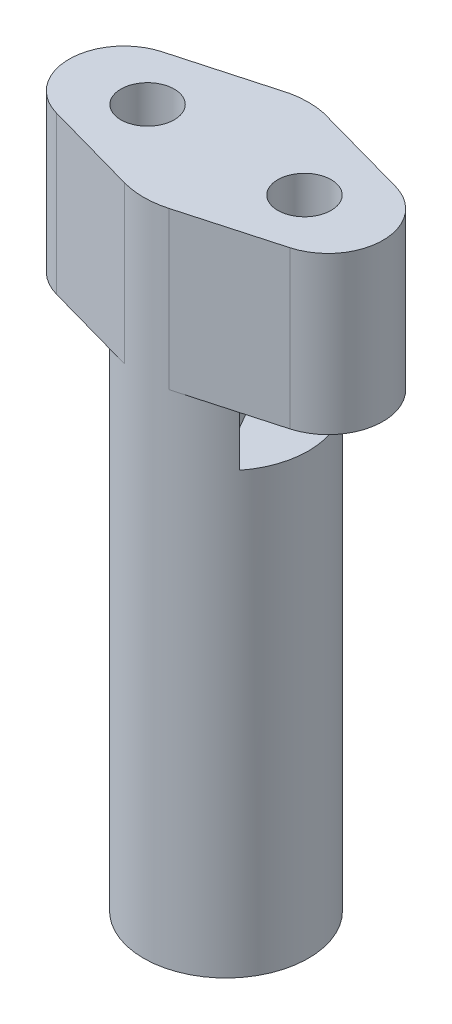
ISO-10303-21;
HEADER;
FILE_DESCRIPTION(('STEP AP214'),'2;1');
FILE_NAME('part.step','',(''),(''),'','','');
FILE_SCHEMA(('AUTOMOTIVE_DESIGN { 1 0 10303 214 1 1 1 1 }'));
ENDSEC;
DATA;
#1=APPLICATION_CONTEXT('core data for automotive mechanical design processes');
#2=APPLICATION_PROTOCOL_DEFINITION('international standard','automotive_design',2000,#1);
#3=PRODUCT_CONTEXT('',#1,'mechanical');
#4=PRODUCT('Part','Part','',(#3));
#5=PRODUCT_RELATED_PRODUCT_CATEGORY('part','',(#4));
#6=PRODUCT_DEFINITION_FORMATION('','',#4);
#7=PRODUCT_DEFINITION_CONTEXT('part definition',#1,'design');
#8=PRODUCT_DEFINITION('design','',#6,#7);
#9=PRODUCT_DEFINITION_SHAPE('','',#8);
#10=(LENGTH_UNIT() NAMED_UNIT(*) SI_UNIT(.MILLI.,.METRE.));
#11=(NAMED_UNIT(*) PLANE_ANGLE_UNIT() SI_UNIT($,.RADIAN.));
#12=(NAMED_UNIT(*) SI_UNIT($,.STERADIAN.) SOLID_ANGLE_UNIT());
#13=UNCERTAINTY_MEASURE_WITH_UNIT(LENGTH_MEASURE(1.E-05),#10,'distance_accuracy_value','');
#14=(GEOMETRIC_REPRESENTATION_CONTEXT(3) GLOBAL_UNCERTAINTY_ASSIGNED_CONTEXT((#13)) GLOBAL_UNIT_ASSIGNED_CONTEXT((#10,
#11,#12)) REPRESENTATION_CONTEXT('',''));
#15=CARTESIAN_POINT('',(0.,0.,0.));
#16=DIRECTION('',(0.,0.,1.));
#17=DIRECTION('',(1.,0.,0.));
#18=AXIS2_PLACEMENT_3D('',#15,#16,#17);
#19=CARTESIAN_POINT('',(0.,28.,0.));
#20=DIRECTION('',(0.,1.,0.));
#21=DIRECTION('',(0.,0.,1.));
#22=AXIS2_PLACEMENT_3D('',#19,#20,#21);
#23=CYLINDRICAL_SURFACE('',#22,5.25);
#24=CARTESIAN_POINT('',(0.,-7.,0.));
#25=DIRECTION('',(0.,1.,0.));
#26=DIRECTION('',(0.,0.,1.));
#27=AXIS2_PLACEMENT_3D('',#24,#25,#26);
#28=CIRCLE('',#27,5.25);
#29=CARTESIAN_POINT('',(0.,-7.,5.25));
#30=VERTEX_POINT('',#29);
#31=EDGE_CURVE('E477',#30,#30,#28,.T.);
#32=ORIENTED_EDGE('',*,*,#31,.T.);
#33=EDGE_LOOP('',(#32));
#34=FACE_BOUND('',#33,.T.);
#35=CARTESIAN_POINT('',(1.71206350918097,28.,-4.9629969313441));
#36=DIRECTION('',(-0.963496527957717,0.,-0.267720825886638));
#37=VECTOR('',#36,1.);
#38=LINE('',#35,#37);
#39=CARTESIAN_POINT('',(1.71206350918097,28.,-4.9629969313441));
#40=VERTEX_POINT('',#39);
#41=CARTESIAN_POINT('',(1.09379345280679,28.,-5.13500632228456));
#42=VERTEX_POINT('',#41);
#43=EDGE_CURVE('E481',#40,#42,#38,.T.);
#44=ORIENTED_EDGE('',*,*,#43,.F.);
#45=DIRECTION('',(0.,1.,0.));
#46=VECTOR('',#45,1.);
#47=CARTESIAN_POINT('',(1.71206350918097,25.,-4.9629969313441));
#48=LINE('',#47,#46);
#49=CARTESIAN_POINT('',(1.71206350918097,25.,-4.9629969313441));
#50=VERTEX_POINT('',#49);
#51=EDGE_CURVE('E357',#50,#40,#48,.T.);
#52=ORIENTED_EDGE('',*,*,#51,.F.);
#53=CARTESIAN_POINT('',(0.,25.,0.));
#54=DIRECTION('',(0.,1.,0.));
#55=DIRECTION('',(0.,0.,1.));
#56=AXIS2_PLACEMENT_3D('',#53,#54,#55);
#57=CIRCLE('',#56,5.25);
#58=CARTESIAN_POINT('',(4.12310562561766,25.,-3.25));
#59=VERTEX_POINT('',#58);
#60=EDGE_CURVE('E335',#59,#50,#57,.T.);
#61=ORIENTED_EDGE('',*,*,#60,.F.);
#62=DIRECTION('',(0.,1.,0.));
#63=VECTOR('',#62,1.);
#64=CARTESIAN_POINT('',(4.12310562561766,21.,-3.25));
#65=LINE('',#64,#63);
#66=CARTESIAN_POINT('',(4.12310562561766,21.,-3.25));
#67=VERTEX_POINT('',#66);
#68=EDGE_CURVE('E414',#67,#59,#65,.T.);
#69=ORIENTED_EDGE('',*,*,#68,.F.);
#70=CARTESIAN_POINT('',(0.,21.,0.));
#71=DIRECTION('',(0.,1.,0.));
#72=DIRECTION('',(0.,0.,1.));
#73=AXIS2_PLACEMENT_3D('',#70,#71,#72);
#74=CIRCLE('',#73,5.25);
#75=CARTESIAN_POINT('',(4.12310562561766,21.,3.25));
#76=VERTEX_POINT('',#75);
#77=EDGE_CURVE('E12',#76,#67,#74,.T.);
#78=ORIENTED_EDGE('',*,*,#77,.F.);
#79=DIRECTION('',(0.,1.,0.));
#80=VECTOR('',#79,1.);
#81=CARTESIAN_POINT('',(4.12310562561766,21.,3.25));
#82=LINE('',#81,#80);
#83=CARTESIAN_POINT('',(4.12310562561766,25.,3.25));
#84=VERTEX_POINT('',#83);
#85=EDGE_CURVE('E114',#76,#84,#82,.T.);
#86=ORIENTED_EDGE('',*,*,#85,.T.);
#87=CARTESIAN_POINT('',(1.41346153846153,25.,5.05614739493321));
#88=VERTEX_POINT('',#87);
#89=EDGE_CURVE('E109',#88,#84,#57,.T.);
#90=ORIENTED_EDGE('',*,*,#89,.F.);
#91=DIRECTION('',(0.,1.,0.));
#92=VECTOR('',#91,1.);
#93=CARTESIAN_POINT('',(1.41346153846153,25.,5.05614739493321));
#94=LINE('',#93,#92);
#95=CARTESIAN_POINT('',(1.41346153846153,35.,5.05614739493321));
#96=VERTEX_POINT('',#95);
#97=EDGE_CURVE('E262',#88,#96,#94,.T.);
#98=ORIENTED_EDGE('',*,*,#97,.T.);
#99=CARTESIAN_POINT('',(0.,35.,0.));
#100=DIRECTION('',(0.,1.,0.));
#101=DIRECTION('',(0.,0.,1.));
#102=AXIS2_PLACEMENT_3D('',#99,#100,#101);
#103=CIRCLE('',#102,5.25);
#104=CARTESIAN_POINT('',(-1.41346153846153,35.,5.05614739493321));
#105=VERTEX_POINT('',#104);
#106=EDGE_CURVE('E267',#105,#96,#103,.T.);
#107=ORIENTED_EDGE('',*,*,#106,.F.);
#108=DIRECTION('',(0.,1.,0.));
#109=VECTOR('',#108,1.);
#110=CARTESIAN_POINT('',(-1.41346153846153,25.,5.05614739493321));
#111=LINE('',#110,#109);
#112=CARTESIAN_POINT('',(-1.41346153846153,25.,5.05614739493321));
#113=VERTEX_POINT('',#112);
#114=EDGE_CURVE('E398',#113,#105,#111,.T.);
#115=ORIENTED_EDGE('',*,*,#114,.F.);
#116=CARTESIAN_POINT('',(0.,25.,0.));
#117=DIRECTION('',(0.,1.,0.));
#118=DIRECTION('',(0.,0.,1.));
#119=AXIS2_PLACEMENT_3D('',#116,#117,#118);
#120=CIRCLE('',#119,5.25);
#121=CARTESIAN_POINT('',(-4.12310562561766,25.,3.25));
#122=VERTEX_POINT('',#121);
#123=EDGE_CURVE('E366',#122,#113,#120,.T.);
#124=ORIENTED_EDGE('',*,*,#123,.F.);
#125=DIRECTION('',(0.,1.,0.));
#126=VECTOR('',#125,1.);
#127=CARTESIAN_POINT('',(-4.12310562561766,21.,3.25));
#128=LINE('',#127,#126);
#129=CARTESIAN_POINT('',(-4.12310562561766,21.,3.25));
#130=VERTEX_POINT('',#129);
#131=EDGE_CURVE('E440',#130,#122,#128,.T.);
#132=ORIENTED_EDGE('',*,*,#131,.F.);
#133=CARTESIAN_POINT('',(0.,21.,0.));
#134=DIRECTION('',(0.,1.,0.));
#135=DIRECTION('',(0.,0.,1.));
#136=AXIS2_PLACEMENT_3D('',#133,#134,#135);
#137=CIRCLE('',#136,5.25);
#138=CARTESIAN_POINT('',(-4.12310562561765,21.,-3.25));
#139=VERTEX_POINT('',#138);
#140=EDGE_CURVE('E101',#139,#130,#137,.T.);
#141=ORIENTED_EDGE('',*,*,#140,.F.);
#142=DIRECTION('',(0.,1.,0.));
#143=VECTOR('',#142,1.);
#144=CARTESIAN_POINT('',(-4.12310562561765,21.,-3.25));
#145=LINE('',#144,#143);
#146=CARTESIAN_POINT('',(-4.12310562561765,25.,-3.25));
#147=VERTEX_POINT('',#146);
#148=EDGE_CURVE('E450',#139,#147,#145,.T.);
#149=ORIENTED_EDGE('',*,*,#148,.T.);
#150=CARTESIAN_POINT('',(-1.71206350918092,25.,-4.96299693134411));
#151=VERTEX_POINT('',#150);
#152=EDGE_CURVE('E369',#151,#147,#120,.T.);
#153=ORIENTED_EDGE('',*,*,#152,.F.);
#154=DIRECTION('',(0.,1.,0.));
#155=VECTOR('',#154,1.);
#156=CARTESIAN_POINT('',(-1.71206350918092,25.,-4.96299693134411));
#157=LINE('',#156,#155);
#158=CARTESIAN_POINT('',(-1.71206350918092,28.,-4.96299693134411));
#159=VERTEX_POINT('',#158);
#160=EDGE_CURVE('E392',#151,#159,#157,.T.);
#161=ORIENTED_EDGE('',*,*,#160,.T.);
#162=CARTESIAN_POINT('',(-1.09375000000006,28.,-5.13480388500864));
#163=DIRECTION('',(-0.963496527957717,0.,0.267720825886639));
#164=VECTOR('',#163,1.);
#165=LINE('',#162,#164);
#166=CARTESIAN_POINT('',(-1.09379808669212,28.,-5.1350275927711));
#167=VERTEX_POINT('',#166);
#168=EDGE_CURVE('E480',#167,#159,#165,.T.);
#169=ORIENTED_EDGE('',*,*,#168,.F.);
#170=DIRECTION('',(0.,-1.,0.));
#171=VECTOR('',#170,1.);
#172=CARTESIAN_POINT('',(-1.09375000000006,35.,-5.13480388500864));
#173=LINE('',#172,#171);
#174=CARTESIAN_POINT('',(-1.09375000000006,35.,-5.13480388500864));
#175=VERTEX_POINT('',#174);
#176=EDGE_CURVE('E310',#175,#167,#173,.T.);
#177=ORIENTED_EDGE('',*,*,#176,.F.);
#178=CARTESIAN_POINT('',(1.09375000000001,35.,-5.13480388500865));
#179=VERTEX_POINT('',#178);
#180=EDGE_CURVE('E290',#179,#175,#103,.T.);
#181=ORIENTED_EDGE('',*,*,#180,.F.);
#182=DIRECTION('',(0.,-1.,0.));
#183=VECTOR('',#182,1.);
#184=CARTESIAN_POINT('',(1.09375000000001,35.,-5.13480388500865));
#185=LINE('',#184,#183);
#186=EDGE_CURVE('E318',#179,#42,#185,.T.);
#187=ORIENTED_EDGE('',*,*,#186,.T.);
#188=EDGE_LOOP('',(#44,#52,#61,#69,#78,#86,#90,#98,#107,#115,#124,#132,#141,#149,#153,#161,#169,
#177,#181,#187));
#189=FACE_BOUND('',#188,.T.);
#190=ADVANCED_FACE('F90',(#34,#189),#23,.T.);
#191=CARTESIAN_POINT('',(0.,-7.,0.));
#192=DIRECTION('',(0.,1.,0.));
#193=DIRECTION('',(0.,0.,1.));
#194=AXIS2_PLACEMENT_3D('',#191,#192,#193);
#195=PLANE('',#194);
#196=ORIENTED_EDGE('',*,*,#31,.F.);
#197=EDGE_LOOP('',(#196));
#198=FACE_BOUND('',#197,.T.);
#199=CARTESIAN_POINT('',(0.,-7.,0.));
#200=DIRECTION('',(0.,1.,0.));
#201=DIRECTION('',(0.,0.,1.));
#202=AXIS2_PLACEMENT_3D('',#199,#200,#201);
#203=CIRCLE('',#202,4.1);
#204=CARTESIAN_POINT('',(0.,-7.,4.1));
#205=VERTEX_POINT('',#204);
#206=EDGE_CURVE('E474',#205,#205,#203,.T.);
#207=ORIENTED_EDGE('',*,*,#206,.T.);
#208=EDGE_LOOP('',(#207));
#209=FACE_BOUND('',#208,.T.);
#210=ADVANCED_FACE('F588',(#198,#209),#195,.F.);
#211=CARTESIAN_POINT('',(0.,28.,0.));
#212=DIRECTION('',(0.,1.,0.));
#213=DIRECTION('',(0.,0.,1.));
#214=AXIS2_PLACEMENT_3D('',#211,#212,#213);
#215=CYLINDRICAL_SURFACE('',#214,4.1);
#216=ORIENTED_EDGE('',*,*,#206,.F.);
#217=EDGE_LOOP('',(#216));
#218=FACE_BOUND('',#217,.T.);
#219=CARTESIAN_POINT('',(0.,0.,0.));
#220=DIRECTION('',(0.,1.,0.));
#221=DIRECTION('',(0.,0.,1.));
#222=AXIS2_PLACEMENT_3D('',#219,#220,#221);
#223=CIRCLE('',#222,4.1);
#224=CARTESIAN_POINT('',(0.,0.,4.1));
#225=VERTEX_POINT('',#224);
#226=EDGE_CURVE('E428',#225,#225,#223,.T.);
#227=ORIENTED_EDGE('',*,*,#226,.T.);
#228=EDGE_LOOP('',(#227));
#229=FACE_BOUND('',#228,.T.);
#230=ADVANCED_FACE('F585',(#218,#229),#215,.F.);
#231=CARTESIAN_POINT('',(0.,0.,0.));
#232=DIRECTION('',(0.,1.,0.));
#233=DIRECTION('',(0.,0.,1.));
#234=AXIS2_PLACEMENT_3D('',#231,#232,#233);
#235=PLANE('',#234);
#236=ORIENTED_EDGE('',*,*,#226,.F.);
#237=EDGE_LOOP('',(#236));
#238=FACE_BOUND('',#237,.T.);
#239=ADVANCED_FACE('F581',(#238),#235,.F.);
#240=CARTESIAN_POINT('',(0.,21.,0.));
#241=DIRECTION('',(0.,1.,0.));
#242=DIRECTION('',(0.,0.,1.));
#243=AXIS2_PLACEMENT_3D('',#240,#241,#242);
#244=PLANE('',#243);
#245=ORIENTED_EDGE('',*,*,#140,.T.);
#246=DIRECTION('',(-1.,0.,0.));
#247=VECTOR('',#246,1.);
#248=CARTESIAN_POINT('',(0.,21.,3.25));
#249=LINE('',#248,#247);
#250=CARTESIAN_POINT('',(-3.12361162513372,21.,3.25));
#251=VERTEX_POINT('',#250);
#252=EDGE_CURVE('E457',#251,#130,#249,.T.);
#253=ORIENTED_EDGE('',*,*,#252,.F.);
#254=DIRECTION('',(-0.5,0.,0.866025403784439));
#255=VECTOR('',#254,1.);
#256=CARTESIAN_POINT('',(-0.935417437700573,21.,-0.540063509461096));
#257=LINE('',#256,#255);
#258=CARTESIAN_POINT('',(-1.24722325026743,21.,0.));
#259=VERTEX_POINT('',#258);
#260=EDGE_CURVE('E468',#259,#251,#257,.T.);
#261=ORIENTED_EDGE('',*,*,#260,.F.);
#262=DIRECTION('',(0.5,0.,0.866025403784439));
#263=VECTOR('',#262,1.);
#264=CARTESIAN_POINT('',(-0.935417437700574,21.,0.540063509461097));
#265=LINE('',#264,#263);
#266=CARTESIAN_POINT('',(-3.12361162513372,21.,-3.25));
#267=VERTEX_POINT('',#266);
#268=EDGE_CURVE('E466',#267,#259,#265,.T.);
#269=ORIENTED_EDGE('',*,*,#268,.F.);
#270=DIRECTION('',(1.,0.,0.));
#271=VECTOR('',#270,1.);
#272=CARTESIAN_POINT('',(0.,21.,-3.25));
#273=LINE('',#272,#271);
#274=EDGE_CURVE('E443',#139,#267,#273,.T.);
#275=ORIENTED_EDGE('',*,*,#274,.F.);
#276=EDGE_LOOP('',(#245,#253,#261,#269,#275));
#277=FACE_BOUND('',#276,.T.);
#278=ADVANCED_FACE('F577',(#277),#244,.T.);
#279=CARTESIAN_POINT('',(0.,21.,-3.25));
#280=DIRECTION('',(0.,0.,1.));
#281=DIRECTION('',(1.,0.,0.));
#282=AXIS2_PLACEMENT_3D('',#279,#280,#281);
#283=PLANE('',#282);
#284=DIRECTION('',(1.,0.,0.));
#285=VECTOR('',#284,1.);
#286=CARTESIAN_POINT('',(0.,28.,-3.25));
#287=LINE('',#286,#285);
#288=CARTESIAN_POINT('',(-6.87638837486628,28.,-3.25));
#289=VERTEX_POINT('',#288);
#290=CARTESIAN_POINT('',(-3.12361162513372,28.,-3.25));
#291=VERTEX_POINT('',#290);
#292=EDGE_CURVE('E453',#289,#291,#287,.T.);
#293=ORIENTED_EDGE('',*,*,#292,.F.);
#294=DIRECTION('',(0.,1.,0.));
#295=VECTOR('',#294,1.);
#296=CARTESIAN_POINT('',(-6.87638837486628,25.,-3.25));
#297=LINE('',#296,#295);
#298=CARTESIAN_POINT('',(-6.87638837486628,25.,-3.25));
#299=VERTEX_POINT('',#298);
#300=EDGE_CURVE('E389',#299,#289,#297,.T.);
#301=ORIENTED_EDGE('',*,*,#300,.F.);
#302=DIRECTION('',(1.,0.,0.));
#303=VECTOR('',#302,1.);
#304=CARTESIAN_POINT('',(0.,25.,-3.25));
#305=LINE('',#304,#303);
#306=EDGE_CURVE('E378',#299,#147,#305,.T.);
#307=ORIENTED_EDGE('',*,*,#306,.T.);
#308=ORIENTED_EDGE('',*,*,#148,.F.);
#309=ORIENTED_EDGE('',*,*,#274,.T.);
#310=DIRECTION('',(0.,1.,0.));
#311=VECTOR('',#310,1.);
#312=CARTESIAN_POINT('',(-3.12361162513372,21.,-3.25));
#313=LINE('',#312,#311);
#314=EDGE_CURVE('E448',#267,#291,#313,.T.);
#315=ORIENTED_EDGE('',*,*,#314,.T.);
#316=EDGE_LOOP('',(#293,#301,#307,#308,#309,#315));
#317=FACE_BOUND('',#316,.T.);
#318=ADVANCED_FACE('F573',(#317),#283,.T.);
#319=CARTESIAN_POINT('',(-0.935417437700574,21.,0.540063509461097));
#320=DIRECTION('',(-0.866025403784439,0.,0.5));
#321=DIRECTION('',(0.5,0.,0.866025403784439));
#322=AXIS2_PLACEMENT_3D('',#319,#320,#321);
#323=PLANE('',#322);
#324=DIRECTION('',(0.5,0.,0.866025403784439));
#325=VECTOR('',#324,1.);
#326=CARTESIAN_POINT('',(-0.935417437700575,28.,0.540063509461097));
#327=LINE('',#326,#325);
#328=CARTESIAN_POINT('',(-1.24722325026743,28.,0.));
#329=VERTEX_POINT('',#328);
#330=EDGE_CURVE('E456',#291,#329,#327,.T.);
#331=ORIENTED_EDGE('',*,*,#330,.F.);
#332=ORIENTED_EDGE('',*,*,#314,.F.);
#333=ORIENTED_EDGE('',*,*,#268,.T.);
#334=DIRECTION('',(0.,1.,0.));
#335=VECTOR('',#334,1.);
#336=CARTESIAN_POINT('',(-1.24722325026743,21.,0.));
#337=LINE('',#336,#335);
#338=EDGE_CURVE('E446',#259,#329,#337,.T.);
#339=ORIENTED_EDGE('',*,*,#338,.T.);
#340=EDGE_LOOP('',(#331,#332,#333,#339));
#341=FACE_BOUND('',#340,.T.);
#342=ADVANCED_FACE('F569',(#341),#323,.T.);
#343=CARTESIAN_POINT('',(-0.935417437700573,21.,-0.540063509461096));
#344=DIRECTION('',(-0.866025403784438,0.,-0.5));
#345=DIRECTION('',(-0.5,0.,0.866025403784439));
#346=AXIS2_PLACEMENT_3D('',#343,#344,#345);
#347=PLANE('',#346);
#348=DIRECTION('',(-0.5,0.,0.866025403784439));
#349=VECTOR('',#348,1.);
#350=CARTESIAN_POINT('',(-0.935417437700574,28.,-0.540063509461096));
#351=LINE('',#350,#349);
#352=CARTESIAN_POINT('',(-3.12361162513372,28.,3.25));
#353=VERTEX_POINT('',#352);
#354=EDGE_CURVE('E460',#329,#353,#351,.T.);
#355=ORIENTED_EDGE('',*,*,#354,.F.);
#356=ORIENTED_EDGE('',*,*,#338,.F.);
#357=ORIENTED_EDGE('',*,*,#260,.T.);
#358=DIRECTION('',(0.,1.,0.));
#359=VECTOR('',#358,1.);
#360=CARTESIAN_POINT('',(-3.12361162513372,21.,3.25));
#361=LINE('',#360,#359);
#362=EDGE_CURVE('E444',#251,#353,#361,.T.);
#363=ORIENTED_EDGE('',*,*,#362,.T.);
#364=EDGE_LOOP('',(#355,#356,#357,#363));
#365=FACE_BOUND('',#364,.T.);
#366=ADVANCED_FACE('F565',(#365),#347,.T.);
#367=CARTESIAN_POINT('',(0.,21.,3.25));
#368=DIRECTION('',(0.,0.,-1.));
#369=DIRECTION('',(-1.,0.,0.));
#370=AXIS2_PLACEMENT_3D('',#367,#368,#369);
#371=PLANE('',#370);
#372=DIRECTION('',(-1.,0.,0.));
#373=VECTOR('',#372,1.);
#374=CARTESIAN_POINT('',(0.,28.,3.25));
#375=LINE('',#374,#373);
#376=CARTESIAN_POINT('',(-6.87638837486628,28.,3.25));
#377=VERTEX_POINT('',#376);
#378=EDGE_CURVE('E419',#353,#377,#375,.T.);
#379=ORIENTED_EDGE('',*,*,#378,.F.);
#380=ORIENTED_EDGE('',*,*,#362,.F.);
#381=ORIENTED_EDGE('',*,*,#252,.T.);
#382=ORIENTED_EDGE('',*,*,#131,.T.);
#383=DIRECTION('',(-1.,0.,0.));
#384=VECTOR('',#383,1.);
#385=CARTESIAN_POINT('',(0.,25.,3.25));
#386=LINE('',#385,#384);
#387=CARTESIAN_POINT('',(-6.87638837486628,25.,3.25));
#388=VERTEX_POINT('',#387);
#389=EDGE_CURVE('E368',#122,#388,#386,.T.);
#390=ORIENTED_EDGE('',*,*,#389,.T.);
#391=DIRECTION('',(0.,1.,0.));
#392=VECTOR('',#391,1.);
#393=CARTESIAN_POINT('',(-6.87638837486628,25.,3.25));
#394=LINE('',#393,#392);
#395=EDGE_CURVE('E396',#388,#377,#394,.T.);
#396=ORIENTED_EDGE('',*,*,#395,.T.);
#397=EDGE_LOOP('',(#379,#380,#381,#382,#390,#396));
#398=FACE_BOUND('',#397,.T.);
#399=ADVANCED_FACE('F547',(#398),#371,.T.);
#400=CARTESIAN_POINT('',(0.,21.,0.));
#401=DIRECTION('',(0.,1.,0.));
#402=DIRECTION('',(0.,0.,1.));
#403=AXIS2_PLACEMENT_3D('',#400,#401,#402);
#404=PLANE('',#403);
#405=ORIENTED_EDGE('',*,*,#77,.T.);
#406=DIRECTION('',(-1.,0.,0.));
#407=VECTOR('',#406,1.);
#408=CARTESIAN_POINT('',(0.,21.,-3.25));
#409=LINE('',#408,#407);
#410=CARTESIAN_POINT('',(3.12361162513372,21.,-3.25));
#411=VERTEX_POINT('',#410);
#412=EDGE_CURVE('E401',#67,#411,#409,.T.);
#413=ORIENTED_EDGE('',*,*,#412,.T.);
#414=DIRECTION('',(-0.5,0.,0.866025403784439));
#415=VECTOR('',#414,1.);
#416=CARTESIAN_POINT('',(0.935417437700576,21.,0.540063509461097));
#417=LINE('',#416,#415);
#418=CARTESIAN_POINT('',(1.24722325026743,21.,0.));
#419=VERTEX_POINT('',#418);
#420=EDGE_CURVE('E404',#411,#419,#417,.T.);
#421=ORIENTED_EDGE('',*,*,#420,.T.);
#422=DIRECTION('',(0.5,0.,0.866025403784439));
#423=VECTOR('',#422,1.);
#424=CARTESIAN_POINT('',(0.935417437700574,21.,-0.540063509461096));
#425=LINE('',#424,#423);
#426=CARTESIAN_POINT('',(3.12361162513372,21.,3.25));
#427=VERTEX_POINT('',#426);
#428=EDGE_CURVE('E408',#419,#427,#425,.T.);
#429=ORIENTED_EDGE('',*,*,#428,.T.);
#430=DIRECTION('',(1.,0.,0.));
#431=VECTOR('',#430,1.);
#432=CARTESIAN_POINT('',(0.,21.,3.25));
#433=LINE('',#432,#431);
#434=EDGE_CURVE('E411',#427,#76,#433,.T.);
#435=ORIENTED_EDGE('',*,*,#434,.T.);
#436=EDGE_LOOP('',(#405,#413,#421,#429,#435));
#437=FACE_BOUND('',#436,.T.);
#438=ADVANCED_FACE('F543',(#437),#404,.T.);
#439=CARTESIAN_POINT('',(0.,21.,3.25));
#440=DIRECTION('',(0.,0.,1.));
#441=DIRECTION('',(1.,0.,0.));
#442=AXIS2_PLACEMENT_3D('',#439,#440,#441);
#443=PLANE('',#442);
#444=DIRECTION('',(1.,0.,0.));
#445=VECTOR('',#444,1.);
#446=CARTESIAN_POINT('',(0.,28.,3.25));
#447=LINE('',#446,#445);
#448=CARTESIAN_POINT('',(3.12361162513372,28.,3.25));
#449=VERTEX_POINT('',#448);
#450=CARTESIAN_POINT('',(6.87638837486628,28.,3.25));
#451=VERTEX_POINT('',#450);
#452=EDGE_CURVE('E405',#449,#451,#447,.T.);
#453=ORIENTED_EDGE('',*,*,#452,.T.);
#454=DIRECTION('',(0.,1.,0.));
#455=VECTOR('',#454,1.);
#456=CARTESIAN_POINT('',(6.87638837486628,25.,3.25));
#457=LINE('',#456,#455);
#458=CARTESIAN_POINT('',(6.87638837486628,25.,3.25));
#459=VERTEX_POINT('',#458);
#460=EDGE_CURVE('E273',#459,#451,#457,.T.);
#461=ORIENTED_EDGE('',*,*,#460,.F.);
#462=DIRECTION('',(1.,0.,0.));
#463=VECTOR('',#462,1.);
#464=CARTESIAN_POINT('',(0.,25.,3.25));
#465=LINE('',#464,#463);
#466=EDGE_CURVE('E343',#84,#459,#465,.T.);
#467=ORIENTED_EDGE('',*,*,#466,.F.);
#468=ORIENTED_EDGE('',*,*,#85,.F.);
#469=ORIENTED_EDGE('',*,*,#434,.F.);
#470=DIRECTION('',(0.,1.,0.));
#471=VECTOR('',#470,1.);
#472=CARTESIAN_POINT('',(3.12361162513372,21.,3.25));
#473=LINE('',#472,#471);
#474=EDGE_CURVE('E429',#427,#449,#473,.T.);
#475=ORIENTED_EDGE('',*,*,#474,.T.);
#476=EDGE_LOOP('',(#453,#461,#467,#468,#469,#475));
#477=FACE_BOUND('',#476,.T.);
#478=ADVANCED_FACE('F546',(#477),#443,.F.);
#479=CARTESIAN_POINT('',(0.935417437700574,21.,-0.540063509461096));
#480=DIRECTION('',(-0.866025403784438,0.,0.5));
#481=DIRECTION('',(0.5,0.,0.866025403784439));
#482=AXIS2_PLACEMENT_3D('',#479,#480,#481);
#483=PLANE('',#482);
#484=DIRECTION('',(0.5,0.,0.866025403784439));
#485=VECTOR('',#484,1.);
#486=CARTESIAN_POINT('',(0.935417437700574,28.,-0.540063509461096));
#487=LINE('',#486,#485);
#488=CARTESIAN_POINT('',(1.24722325026743,28.,0.));
#489=VERTEX_POINT('',#488);
#490=EDGE_CURVE('E422',#489,#449,#487,.T.);
#491=ORIENTED_EDGE('',*,*,#490,.T.);
#492=ORIENTED_EDGE('',*,*,#474,.F.);
#493=ORIENTED_EDGE('',*,*,#428,.F.);
#494=DIRECTION('',(0.,1.,0.));
#495=VECTOR('',#494,1.);
#496=CARTESIAN_POINT('',(1.24722325026743,21.,0.));
#497=LINE('',#496,#495);
#498=EDGE_CURVE('E432',#419,#489,#497,.T.);
#499=ORIENTED_EDGE('',*,*,#498,.T.);
#500=EDGE_LOOP('',(#491,#492,#493,#499));
#501=FACE_BOUND('',#500,.T.);
#502=ADVANCED_FACE('F551',(#501),#483,.F.);
#503=CARTESIAN_POINT('',(0.935417437700576,21.,0.540063509461097));
#504=DIRECTION('',(-0.866025403784439,0.,-0.5));
#505=DIRECTION('',(-0.5,0.,0.866025403784439));
#506=AXIS2_PLACEMENT_3D('',#503,#504,#505);
#507=PLANE('',#506);
#508=DIRECTION('',(-0.5,0.,0.866025403784439));
#509=VECTOR('',#508,1.);
#510=CARTESIAN_POINT('',(0.935417437700575,28.,0.540063509461097));
#511=LINE('',#510,#509);
#512=CARTESIAN_POINT('',(3.12361162513372,28.,-3.25));
#513=VERTEX_POINT('',#512);
#514=EDGE_CURVE('E418',#513,#489,#511,.T.);
#515=ORIENTED_EDGE('',*,*,#514,.T.);
#516=ORIENTED_EDGE('',*,*,#498,.F.);
#517=ORIENTED_EDGE('',*,*,#420,.F.);
#518=DIRECTION('',(0.,1.,0.));
#519=VECTOR('',#518,1.);
#520=CARTESIAN_POINT('',(3.12361162513372,21.,-3.25));
#521=LINE('',#520,#519);
#522=EDGE_CURVE('E435',#411,#513,#521,.T.);
#523=ORIENTED_EDGE('',*,*,#522,.T.);
#524=EDGE_LOOP('',(#515,#516,#517,#523));
#525=FACE_BOUND('',#524,.T.);
#526=ADVANCED_FACE('F555',(#525),#507,.F.);
#527=CARTESIAN_POINT('',(0.,21.,-3.25));
#528=DIRECTION('',(0.,0.,-1.));
#529=DIRECTION('',(-1.,0.,0.));
#530=AXIS2_PLACEMENT_3D('',#527,#528,#529);
#531=PLANE('',#530);
#532=DIRECTION('',(-1.,0.,0.));
#533=VECTOR('',#532,1.);
#534=CARTESIAN_POINT('',(0.,28.,-3.25));
#535=LINE('',#534,#533);
#536=CARTESIAN_POINT('',(6.87638837486628,28.,-3.25));
#537=VERTEX_POINT('',#536);
#538=EDGE_CURVE('E415',#537,#513,#535,.T.);
#539=ORIENTED_EDGE('',*,*,#538,.T.);
#540=ORIENTED_EDGE('',*,*,#522,.F.);
#541=ORIENTED_EDGE('',*,*,#412,.F.);
#542=ORIENTED_EDGE('',*,*,#68,.T.);
#543=DIRECTION('',(-1.,0.,0.));
#544=VECTOR('',#543,1.);
#545=CARTESIAN_POINT('',(0.,25.,-3.25));
#546=LINE('',#545,#544);
#547=CARTESIAN_POINT('',(6.87638837486628,25.,-3.25));
#548=VERTEX_POINT('',#547);
#549=EDGE_CURVE('E337',#548,#59,#546,.T.);
#550=ORIENTED_EDGE('',*,*,#549,.F.);
#551=DIRECTION('',(0.,1.,0.));
#552=VECTOR('',#551,1.);
#553=CARTESIAN_POINT('',(6.87638837486628,25.,-3.25));
#554=LINE('',#553,#552);
#555=EDGE_CURVE('E354',#548,#537,#554,.T.);
#556=ORIENTED_EDGE('',*,*,#555,.T.);
#557=EDGE_LOOP('',(#539,#540,#541,#542,#550,#556));
#558=FACE_BOUND('',#557,.T.);
#559=ADVANCED_FACE('F541',(#558),#531,.F.);
#560=CARTESIAN_POINT('',(-6.5,25.,0.));
#561=DIRECTION('',(0.,1.,0.));
#562=DIRECTION('',(-1.,0.,0.));
#563=AXIS2_PLACEMENT_3D('',#560,#561,#562);
#564=CYLINDRICAL_SURFACE('',#563,3.5);
#565=DIRECTION('',(0.,1.,0.));
#566=VECTOR('',#565,1.);
#567=CARTESIAN_POINT('',(-7.44230769230769,25.,3.37076492995548));
#568=LINE('',#567,#566);
#569=CARTESIAN_POINT('',(-7.44230769230769,25.,3.37076492995548));
#570=VERTEX_POINT('',#569);
#571=CARTESIAN_POINT('',(-7.44230769230769,35.,3.37076492995548));
#572=VERTEX_POINT('',#571);
#573=EDGE_CURVE('E384',#570,#572,#568,.T.);
#574=ORIENTED_EDGE('',*,*,#573,.T.);
#575=CARTESIAN_POINT('',(-6.5,35.,0.));
#576=DIRECTION('',(0.,1.,0.));
#577=DIRECTION('',(0.,0.,1.));
#578=AXIS2_PLACEMENT_3D('',#575,#576,#577);
#579=CIRCLE('',#578,3.5);
#580=CARTESIAN_POINT('',(-7.43702289060323,35.,-3.37223784785201));
#581=VERTEX_POINT('',#580);
#582=EDGE_CURVE('E300',#572,#581,#579,.F.);
#583=ORIENTED_EDGE('',*,*,#582,.T.);
#584=DIRECTION('',(0.,1.,0.));
#585=VECTOR('',#584,1.);
#586=CARTESIAN_POINT('',(-7.43702289060323,25.,-3.37223784785201));
#587=LINE('',#586,#585);
#588=CARTESIAN_POINT('',(-7.43702289060323,25.,-3.37223784785201));
#589=VERTEX_POINT('',#588);
#590=EDGE_CURVE('E452',#589,#581,#587,.T.);
#591=ORIENTED_EDGE('',*,*,#590,.F.);
#592=CARTESIAN_POINT('',(-6.5,25.,0.));
#593=DIRECTION('',(0.,1.,0.));
#594=DIRECTION('',(0.,0.,1.));
#595=AXIS2_PLACEMENT_3D('',#592,#593,#594);
#596=CIRCLE('',#595,3.5);
#597=EDGE_CURVE('E360',#570,#589,#596,.F.);
#598=ORIENTED_EDGE('',*,*,#597,.F.);
#599=EDGE_LOOP('',(#574,#583,#591,#598));
#600=FACE_BOUND('',#599,.T.);
#601=ADVANCED_FACE('F525',(#600),#564,.T.);
#602=CARTESIAN_POINT('',(-1.40290675459049,25.,-5.04890040817638));
#603=DIRECTION('',(0.267720825886639,0.,0.963496527957717));
#604=DIRECTION('',(0.963496527957717,0.,-0.267720825886639));
#605=AXIS2_PLACEMENT_3D('',#602,#603,#604);
#606=PLANE('',#605);
#607=ORIENTED_EDGE('',*,*,#590,.T.);
#608=DIRECTION('',(0.963496527957717,0.,-0.267720825886639));
#609=VECTOR('',#608,1.);
#610=CARTESIAN_POINT('',(-1.40290675459049,35.,-5.04890040817638));
#611=LINE('',#610,#609);
#612=EDGE_CURVE('E294',#581,#175,#611,.T.);
#613=ORIENTED_EDGE('',*,*,#612,.T.);
#614=ORIENTED_EDGE('',*,*,#176,.T.);
#615=ORIENTED_EDGE('',*,*,#168,.T.);
#616=ORIENTED_EDGE('',*,*,#160,.F.);
#617=DIRECTION('',(0.963496527957717,0.,-0.267720825886639));
#618=VECTOR('',#617,1.);
#619=CARTESIAN_POINT('',(-1.40290675459049,25.,-5.04890040817638));
#620=LINE('',#619,#618);
#621=EDGE_CURVE('E381',#589,#151,#620,.T.);
#622=ORIENTED_EDGE('',*,*,#621,.F.);
#623=EDGE_LOOP('',(#607,#613,#614,#615,#616,#622));
#624=FACE_BOUND('',#623,.T.);
#625=ADVANCED_FACE('F514',(#624),#606,.F.);
#626=CARTESIAN_POINT('',(-6.56458256229942,25.,-3.7900635094611));
#627=DIRECTION('',(0.866025403784439,0.,0.5));
#628=DIRECTION('',(0.5,0.,-0.866025403784439));
#629=AXIS2_PLACEMENT_3D('',#626,#627,#628);
#630=PLANE('',#629);
#631=DIRECTION('',(0.5,0.,-0.866025403784439));
#632=VECTOR('',#631,1.);
#633=CARTESIAN_POINT('',(-6.56458256229942,28.,-3.7900635094611));
#634=LINE('',#633,#632);
#635=CARTESIAN_POINT('',(-8.75277674973256,28.,0.));
#636=VERTEX_POINT('',#635);
#637=EDGE_CURVE('E364',#636,#289,#634,.T.);
#638=ORIENTED_EDGE('',*,*,#637,.F.);
#639=DIRECTION('',(0.,1.,0.));
#640=VECTOR('',#639,1.);
#641=CARTESIAN_POINT('',(-8.75277674973256,25.,0.));
#642=LINE('',#641,#640);
#643=CARTESIAN_POINT('',(-8.75277674973256,25.,0.));
#644=VERTEX_POINT('',#643);
#645=EDGE_CURVE('E393',#644,#636,#642,.T.);
#646=ORIENTED_EDGE('',*,*,#645,.F.);
#647=DIRECTION('',(0.5,0.,-0.866025403784439));
#648=VECTOR('',#647,1.);
#649=CARTESIAN_POINT('',(-6.56458256229942,25.,-3.7900635094611));
#650=LINE('',#649,#648);
#651=EDGE_CURVE('E375',#644,#299,#650,.T.);
#652=ORIENTED_EDGE('',*,*,#651,.T.);
#653=ORIENTED_EDGE('',*,*,#300,.T.);
#654=EDGE_LOOP('',(#638,#646,#652,#653));
#655=FACE_BOUND('',#654,.T.);
#656=ADVANCED_FACE('F524',(#655),#630,.T.);
#657=CARTESIAN_POINT('',(-6.56458256229943,25.,3.79006350946109));
#658=DIRECTION('',(0.866025403784439,0.,-0.5));
#659=DIRECTION('',(-0.5,0.,-0.866025403784439));
#660=AXIS2_PLACEMENT_3D('',#657,#658,#659);
#661=PLANE('',#660);
#662=DIRECTION('',(-0.5,0.,-0.866025403784439));
#663=VECTOR('',#662,1.);
#664=CARTESIAN_POINT('',(-6.56458256229943,28.,3.79006350946109));
#665=LINE('',#664,#663);
#666=EDGE_CURVE('E272',#377,#636,#665,.T.);
#667=ORIENTED_EDGE('',*,*,#666,.F.);
#668=ORIENTED_EDGE('',*,*,#395,.F.);
#669=DIRECTION('',(-0.5,0.,-0.866025403784439));
#670=VECTOR('',#669,1.);
#671=CARTESIAN_POINT('',(-6.56458256229943,25.,3.79006350946109));
#672=LINE('',#671,#670);
#673=EDGE_CURVE('E372',#388,#644,#672,.T.);
#674=ORIENTED_EDGE('',*,*,#673,.T.);
#675=ORIENTED_EDGE('',*,*,#645,.T.);
#676=EDGE_LOOP('',(#667,#668,#674,#675));
#677=FACE_BOUND('',#676,.T.);
#678=ADVANCED_FACE('F530',(#677),#661,.T.);
#679=CARTESIAN_POINT('',(-1.41346153846153,25.,5.05614739493321));
#680=DIRECTION('',(0.269230769230768,0.,-0.963075694272994));
#681=DIRECTION('',(-0.963075694272994,0.,-0.269230769230768));
#682=AXIS2_PLACEMENT_3D('',#679,#680,#681);
#683=PLANE('',#682);
#684=ORIENTED_EDGE('',*,*,#114,.T.);
#685=DIRECTION('',(-0.963075694272994,0.,-0.269230769230768));
#686=VECTOR('',#685,1.);
#687=CARTESIAN_POINT('',(-1.41346153846153,35.,5.05614739493321));
#688=LINE('',#687,#686);
#689=EDGE_CURVE('E287',#105,#572,#688,.T.);
#690=ORIENTED_EDGE('',*,*,#689,.T.);
#691=ORIENTED_EDGE('',*,*,#573,.F.);
#692=DIRECTION('',(-0.963075694272994,0.,-0.269230769230768));
#693=VECTOR('',#692,1.);
#694=CARTESIAN_POINT('',(-1.41346153846153,25.,5.05614739493321));
#695=LINE('',#694,#693);
#696=EDGE_CURVE('E363',#113,#570,#695,.T.);
#697=ORIENTED_EDGE('',*,*,#696,.F.);
#698=EDGE_LOOP('',(#684,#690,#691,#697));
#699=FACE_BOUND('',#698,.T.);
#700=ADVANCED_FACE('F534',(#699),#683,.F.);
#701=CARTESIAN_POINT('',(0.,25.,0.));
#702=DIRECTION('',(0.,1.,0.));
#703=DIRECTION('',(0.,0.,1.));
#704=AXIS2_PLACEMENT_3D('',#701,#702,#703);
#705=PLANE('',#704);
#706=ORIENTED_EDGE('',*,*,#597,.T.);
#707=ORIENTED_EDGE('',*,*,#621,.T.);
#708=ORIENTED_EDGE('',*,*,#152,.T.);
#709=ORIENTED_EDGE('',*,*,#306,.F.);
#710=ORIENTED_EDGE('',*,*,#651,.F.);
#711=ORIENTED_EDGE('',*,*,#673,.F.);
#712=ORIENTED_EDGE('',*,*,#389,.F.);
#713=ORIENTED_EDGE('',*,*,#123,.T.);
#714=ORIENTED_EDGE('',*,*,#696,.T.);
#715=EDGE_LOOP('',(#706,#707,#708,#709,#710,#711,#712,#713,#714));
#716=FACE_BOUND('',#715,.T.);
#717=ADVANCED_FACE('F526',(#716),#705,.F.);
#718=CARTESIAN_POINT('',(1.41346153846153,25.,5.05614739493321));
#719=DIRECTION('',(0.269230769230768,0.,0.963075694272994));
#720=DIRECTION('',(0.963075694272994,0.,-0.269230769230768));
#721=AXIS2_PLACEMENT_3D('',#718,#719,#720);
#722=PLANE('',#721);
#723=DIRECTION('',(0.,1.,0.));
#724=VECTOR('',#723,1.);
#725=CARTESIAN_POINT('',(7.44230769230769,25.,3.37076492995548));
#726=LINE('',#725,#724);
#727=CARTESIAN_POINT('',(7.44230769230769,25.,3.37076492995548));
#728=VERTEX_POINT('',#727);
#729=CARTESIAN_POINT('',(7.44230769230769,35.,3.37076492995548));
#730=VERTEX_POINT('',#729);
#731=EDGE_CURVE('E278',#728,#730,#726,.T.);
#732=ORIENTED_EDGE('',*,*,#731,.T.);
#733=DIRECTION('',(0.963075694272994,0.,-0.269230769230768));
#734=VECTOR('',#733,1.);
#735=CARTESIAN_POINT('',(1.41346153846153,35.,5.05614739493321));
#736=LINE('',#735,#734);
#737=EDGE_CURVE('E276',#96,#730,#736,.T.);
#738=ORIENTED_EDGE('',*,*,#737,.F.);
#739=ORIENTED_EDGE('',*,*,#97,.F.);
#740=DIRECTION('',(0.963075694272994,0.,-0.269230769230768));
#741=VECTOR('',#740,1.);
#742=CARTESIAN_POINT('',(1.41346153846153,25.,5.05614739493321));
#743=LINE('',#742,#741);
#744=EDGE_CURVE('E326',#88,#728,#743,.T.);
#745=ORIENTED_EDGE('',*,*,#744,.T.);
#746=EDGE_LOOP('',(#732,#738,#739,#745));
#747=FACE_BOUND('',#746,.T.);
#748=ADVANCED_FACE('F277',(#747),#722,.T.);
#749=CARTESIAN_POINT('',(6.56458256229943,25.,3.79006350946109));
#750=DIRECTION('',(0.866025403784439,0.,0.5));
#751=DIRECTION('',(0.5,0.,-0.866025403784439));
#752=AXIS2_PLACEMENT_3D('',#749,#750,#751);
#753=PLANE('',#752);
#754=DIRECTION('',(0.5,0.,-0.866025403784439));
#755=VECTOR('',#754,1.);
#756=CARTESIAN_POINT('',(6.56458256229943,28.,3.79006350946109));
#757=LINE('',#756,#755);
#758=CARTESIAN_POINT('',(8.75277674973256,28.,0.));
#759=VERTEX_POINT('',#758);
#760=EDGE_CURVE('E329',#451,#759,#757,.T.);
#761=ORIENTED_EDGE('',*,*,#760,.T.);
#762=DIRECTION('',(0.,1.,0.));
#763=VECTOR('',#762,1.);
#764=CARTESIAN_POINT('',(8.75277674973256,25.,0.));
#765=LINE('',#764,#763);
#766=CARTESIAN_POINT('',(8.75277674973256,25.,0.));
#767=VERTEX_POINT('',#766);
#768=EDGE_CURVE('E351',#767,#759,#765,.T.);
#769=ORIENTED_EDGE('',*,*,#768,.F.);
#770=DIRECTION('',(0.5,0.,-0.866025403784439));
#771=VECTOR('',#770,1.);
#772=CARTESIAN_POINT('',(6.56458256229943,25.,3.79006350946109));
#773=LINE('',#772,#771);
#774=EDGE_CURVE('E341',#459,#767,#773,.T.);
#775=ORIENTED_EDGE('',*,*,#774,.F.);
#776=ORIENTED_EDGE('',*,*,#460,.T.);
#777=EDGE_LOOP('',(#761,#769,#775,#776));
#778=FACE_BOUND('',#777,.T.);
#779=ADVANCED_FACE('F712',(#778),#753,.F.);
#780=CARTESIAN_POINT('',(6.56458256229942,25.,-3.7900635094611));
#781=DIRECTION('',(0.866025403784439,0.,-0.5));
#782=DIRECTION('',(-0.5,0.,-0.866025403784439));
#783=AXIS2_PLACEMENT_3D('',#780,#781,#782);
#784=PLANE('',#783);
#785=DIRECTION('',(-0.5,0.,-0.866025403784439));
#786=VECTOR('',#785,1.);
#787=CARTESIAN_POINT('',(6.56458256229942,28.,-3.7900635094611));
#788=LINE('',#787,#786);
#789=EDGE_CURVE('E323',#759,#537,#788,.T.);
#790=ORIENTED_EDGE('',*,*,#789,.T.);
#791=ORIENTED_EDGE('',*,*,#555,.F.);
#792=DIRECTION('',(-0.5,0.,-0.866025403784439));
#793=VECTOR('',#792,1.);
#794=CARTESIAN_POINT('',(6.56458256229942,25.,-3.7900635094611));
#795=LINE('',#794,#793);
#796=EDGE_CURVE('E339',#767,#548,#795,.T.);
#797=ORIENTED_EDGE('',*,*,#796,.F.);
#798=ORIENTED_EDGE('',*,*,#768,.T.);
#799=EDGE_LOOP('',(#790,#791,#797,#798));
#800=FACE_BOUND('',#799,.T.);
#801=ADVANCED_FACE('F722',(#800),#784,.F.);
#802=CARTESIAN_POINT('',(1.40290675459049,25.,-5.04890040817637));
#803=DIRECTION('',(0.267720825886638,0.,-0.963496527957717));
#804=DIRECTION('',(-0.963496527957717,0.,-0.267720825886638));
#805=AXIS2_PLACEMENT_3D('',#802,#803,#804);
#806=PLANE('',#805);
#807=ORIENTED_EDGE('',*,*,#51,.T.);
#808=ORIENTED_EDGE('',*,*,#43,.T.);
#809=ORIENTED_EDGE('',*,*,#186,.F.);
#810=DIRECTION('',(-0.963496527957717,0.,-0.267720825886638));
#811=VECTOR('',#810,1.);
#812=CARTESIAN_POINT('',(1.40290675459049,35.,-5.04890040817637));
#813=LINE('',#812,#811);
#814=CARTESIAN_POINT('',(7.43702289060323,35.,-3.37223784785201));
#815=VERTEX_POINT('',#814);
#816=EDGE_CURVE('E295',#815,#179,#813,.T.);
#817=ORIENTED_EDGE('',*,*,#816,.F.);
#818=DIRECTION('',(0.,1.,0.));
#819=VECTOR('',#818,1.);
#820=CARTESIAN_POINT('',(7.43702289060323,25.,-3.37223784785201));
#821=LINE('',#820,#819);
#822=CARTESIAN_POINT('',(7.43702289060323,25.,-3.37223784785201));
#823=VERTEX_POINT('',#822);
#824=EDGE_CURVE('E359',#823,#815,#821,.T.);
#825=ORIENTED_EDGE('',*,*,#824,.F.);
#826=DIRECTION('',(-0.963496527957717,0.,-0.267720825886638));
#827=VECTOR('',#826,1.);
#828=CARTESIAN_POINT('',(1.40290675459049,25.,-5.04890040817637));
#829=LINE('',#828,#827);
#830=EDGE_CURVE('E332',#823,#50,#829,.T.);
#831=ORIENTED_EDGE('',*,*,#830,.T.);
#832=EDGE_LOOP('',(#807,#808,#809,#817,#825,#831));
#833=FACE_BOUND('',#832,.T.);
#834=ADVANCED_FACE('F733',(#833),#806,.T.);
#835=CARTESIAN_POINT('',(6.5,25.,0.));
#836=DIRECTION('',(0.,1.,0.));
#837=DIRECTION('',(-1.,0.,0.));
#838=AXIS2_PLACEMENT_3D('',#835,#836,#837);
#839=CYLINDRICAL_SURFACE('',#838,3.5);
#840=ORIENTED_EDGE('',*,*,#824,.T.);
#841=CARTESIAN_POINT('',(6.5,35.,0.));
#842=DIRECTION('',(0.,1.,0.));
#843=DIRECTION('',(0.,0.,1.));
#844=AXIS2_PLACEMENT_3D('',#841,#842,#843);
#845=CIRCLE('',#844,3.5);
#846=EDGE_CURVE('E282',#730,#815,#845,.T.);
#847=ORIENTED_EDGE('',*,*,#846,.F.);
#848=ORIENTED_EDGE('',*,*,#731,.F.);
#849=CARTESIAN_POINT('',(6.5,25.,0.));
#850=DIRECTION('',(0.,1.,0.));
#851=DIRECTION('',(0.,0.,1.));
#852=AXIS2_PLACEMENT_3D('',#849,#850,#851);
#853=CIRCLE('',#852,3.5);
#854=EDGE_CURVE('E328',#728,#823,#853,.T.);
#855=ORIENTED_EDGE('',*,*,#854,.T.);
#856=EDGE_LOOP('',(#840,#847,#848,#855));
#857=FACE_BOUND('',#856,.T.);
#858=ADVANCED_FACE('F744',(#857),#839,.T.);
#859=CARTESIAN_POINT('',(0.,25.,0.));
#860=DIRECTION('',(0.,1.,0.));
#861=DIRECTION('',(0.,0.,1.));
#862=AXIS2_PLACEMENT_3D('',#859,#860,#861);
#863=PLANE('',#862);
#864=ORIENTED_EDGE('',*,*,#744,.F.);
#865=ORIENTED_EDGE('',*,*,#89,.T.);
#866=ORIENTED_EDGE('',*,*,#466,.T.);
#867=ORIENTED_EDGE('',*,*,#774,.T.);
#868=ORIENTED_EDGE('',*,*,#796,.T.);
#869=ORIENTED_EDGE('',*,*,#549,.T.);
#870=ORIENTED_EDGE('',*,*,#60,.T.);
#871=ORIENTED_EDGE('',*,*,#830,.F.);
#872=ORIENTED_EDGE('',*,*,#854,.F.);
#873=EDGE_LOOP('',(#864,#865,#866,#867,#868,#869,#870,#871,#872));
#874=FACE_BOUND('',#873,.T.);
#875=ADVANCED_FACE('F611',(#874),#863,.F.);
#876=CARTESIAN_POINT('',(0.,28.,0.));
#877=DIRECTION('',(0.,1.,0.));
#878=DIRECTION('',(0.,0.,1.));
#879=AXIS2_PLACEMENT_3D('',#876,#877,#878);
#880=PLANE('',#879);
#881=CARTESIAN_POINT('',(-5.,28.,0.));
#882=DIRECTION('',(0.,1.,0.));
#883=DIRECTION('',(0.,0.,1.));
#884=AXIS2_PLACEMENT_3D('',#881,#882,#883);
#885=CIRCLE('',#884,1.7);
#886=CARTESIAN_POINT('',(-5.,28.,1.7));
#887=VERTEX_POINT('',#886);
#888=EDGE_CURVE('E314',#887,#887,#885,.T.);
#889=ORIENTED_EDGE('',*,*,#888,.T.);
#890=EDGE_LOOP('',(#889));
#891=FACE_BOUND('',#890,.T.);
#892=ORIENTED_EDGE('',*,*,#666,.T.);
#893=ORIENTED_EDGE('',*,*,#637,.T.);
#894=ORIENTED_EDGE('',*,*,#292,.T.);
#895=ORIENTED_EDGE('',*,*,#330,.T.);
#896=ORIENTED_EDGE('',*,*,#354,.T.);
#897=ORIENTED_EDGE('',*,*,#378,.T.);
#898=EDGE_LOOP('',(#892,#893,#894,#895,#896,#897));
#899=FACE_BOUND('',#898,.T.);
#900=ADVANCED_FACE('F760',(#891,#899),#880,.F.);
#901=CARTESIAN_POINT('',(-5.,35.,0.));
#902=DIRECTION('',(0.,-1.,0.));
#903=DIRECTION('',(1.,0.,0.));
#904=AXIS2_PLACEMENT_3D('',#901,#902,#903);
#905=CYLINDRICAL_SURFACE('',#904,1.7);
#906=CARTESIAN_POINT('',(-5.,35.,0.));
#907=DIRECTION('',(0.,1.,0.));
#908=DIRECTION('',(0.,0.,1.));
#909=AXIS2_PLACEMENT_3D('',#906,#907,#908);
#910=CIRCLE('',#909,1.7);
#911=CARTESIAN_POINT('',(-5.,35.,1.7));
#912=VERTEX_POINT('',#911);
#913=EDGE_CURVE('E288',#912,#912,#910,.T.);
#914=ORIENTED_EDGE('',*,*,#913,.T.);
#915=EDGE_LOOP('',(#914));
#916=FACE_BOUND('',#915,.T.);
#917=ORIENTED_EDGE('',*,*,#888,.F.);
#918=EDGE_LOOP('',(#917));
#919=FACE_BOUND('',#918,.T.);
#920=ADVANCED_FACE('F765',(#916,#919),#905,.F.);
#921=CARTESIAN_POINT('',(5.,35.,0.));
#922=DIRECTION('',(0.,-1.,0.));
#923=DIRECTION('',(1.,0.,0.));
#924=AXIS2_PLACEMENT_3D('',#921,#922,#923);
#925=CYLINDRICAL_SURFACE('',#924,1.70000000000001);
#926=CARTESIAN_POINT('',(5.,35.,0.));
#927=DIRECTION('',(0.,1.,0.));
#928=DIRECTION('',(0.,0.,1.));
#929=AXIS2_PLACEMENT_3D('',#926,#927,#928);
#930=CIRCLE('',#929,1.70000000000001);
#931=CARTESIAN_POINT('',(5.,35.,1.70000000000001));
#932=VERTEX_POINT('',#931);
#933=EDGE_CURVE('E292',#932,#932,#930,.F.);
#934=ORIENTED_EDGE('',*,*,#933,.F.);
#935=EDGE_LOOP('',(#934));
#936=FACE_BOUND('',#935,.T.);
#937=CARTESIAN_POINT('',(5.,28.,0.));
#938=DIRECTION('',(0.,1.,0.));
#939=DIRECTION('',(0.,0.,1.));
#940=AXIS2_PLACEMENT_3D('',#937,#938,#939);
#941=CIRCLE('',#940,1.70000000000001);
#942=CARTESIAN_POINT('',(5.,28.,1.70000000000001));
#943=VERTEX_POINT('',#942);
#944=EDGE_CURVE('E311',#943,#943,#941,.F.);
#945=ORIENTED_EDGE('',*,*,#944,.T.);
#946=EDGE_LOOP('',(#945));
#947=FACE_BOUND('',#946,.T.);
#948=ADVANCED_FACE('F777',(#936,#947),#925,.F.);
#949=CARTESIAN_POINT('',(0.,35.,0.));
#950=DIRECTION('',(0.,1.,0.));
#951=DIRECTION('',(0.,0.,1.));
#952=AXIS2_PLACEMENT_3D('',#949,#950,#951);
#953=PLANE('',#952);
#954=ORIENTED_EDGE('',*,*,#933,.T.);
#955=EDGE_LOOP('',(#954));
#956=FACE_BOUND('',#955,.T.);
#957=ORIENTED_EDGE('',*,*,#913,.F.);
#958=EDGE_LOOP('',(#957));
#959=FACE_BOUND('',#958,.T.);
#960=ORIENTED_EDGE('',*,*,#106,.T.);
#961=ORIENTED_EDGE('',*,*,#737,.T.);
#962=ORIENTED_EDGE('',*,*,#846,.T.);
#963=ORIENTED_EDGE('',*,*,#816,.T.);
#964=ORIENTED_EDGE('',*,*,#180,.T.);
#965=ORIENTED_EDGE('',*,*,#612,.F.);
#966=ORIENTED_EDGE('',*,*,#582,.F.);
#967=ORIENTED_EDGE('',*,*,#689,.F.);
#968=EDGE_LOOP('',(#960,#961,#962,#963,#964,#965,#966,#967));
#969=FACE_BOUND('',#968,.T.);
#970=ADVANCED_FACE('F284',(#956,#959,#969),#953,.T.);
#971=ORIENTED_EDGE('',*,*,#760,.F.);
#972=ORIENTED_EDGE('',*,*,#452,.F.);
#973=ORIENTED_EDGE('',*,*,#490,.F.);
#974=ORIENTED_EDGE('',*,*,#514,.F.);
#975=ORIENTED_EDGE('',*,*,#538,.F.);
#976=ORIENTED_EDGE('',*,*,#789,.F.);
#977=EDGE_LOOP('',(#971,#972,#973,#974,#975,#976));
#978=FACE_BOUND('',#977,.T.);
#979=ORIENTED_EDGE('',*,*,#944,.F.);
#980=EDGE_LOOP('',(#979));
#981=FACE_BOUND('',#980,.T.);
#982=ADVANCED_FACE('F768',(#978,#981),#880,.F.);
#983=CLOSED_SHELL('',(#190,#210,#230,#239,#278,#318,#342,#366,#399,#438,#478,#502,#526,#559,
#601,#625,#656,#678,#700,#717,#748,#779,#801,#834,#858,#875,#900,#920,#948,#970,#982));
#984=MANIFOLD_SOLID_BREP('B2',#983);
#985=ADVANCED_BREP_SHAPE_REPRESENTATION('',(#18,#984),#14);
#986=SHAPE_DEFINITION_REPRESENTATION(#9,#985);
ENDSEC;
END-ISO-10303-21;
